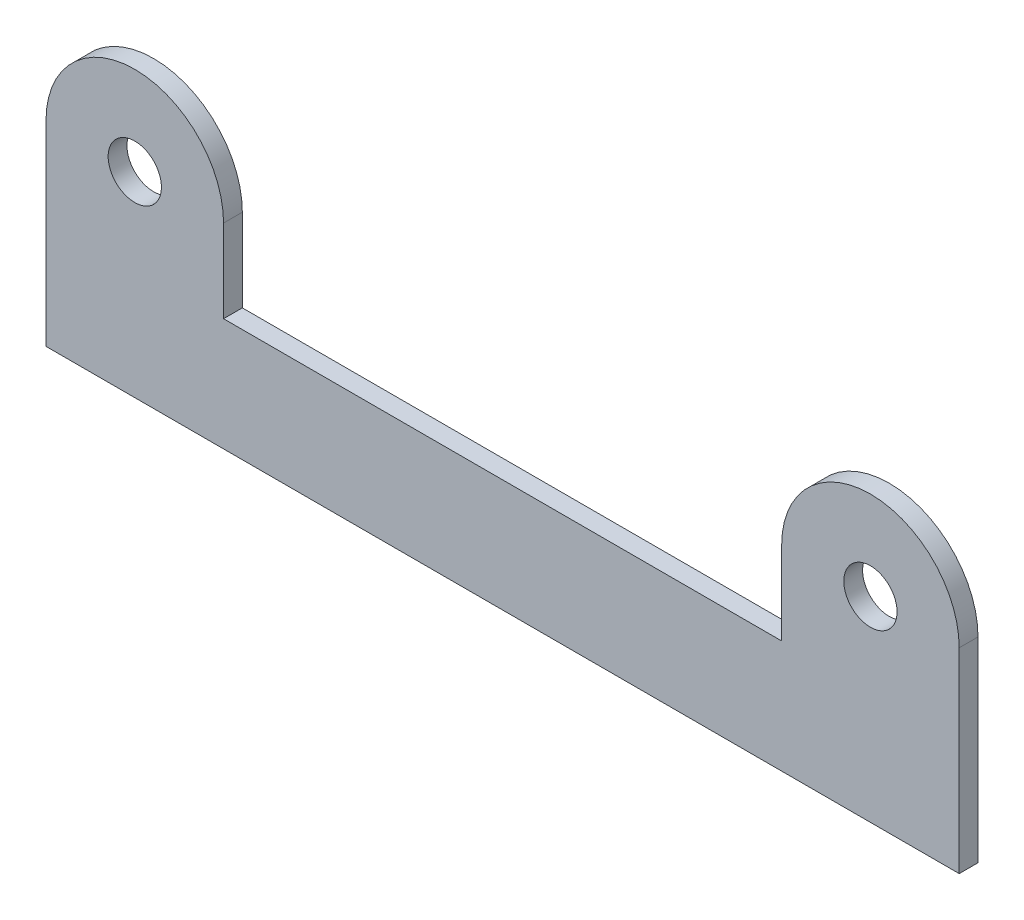
ISO-10303-21;
HEADER;
FILE_DESCRIPTION(('STEP AP214'),'2;1');
FILE_NAME('part.step','',(''),(''),'','','');
FILE_SCHEMA(('AUTOMOTIVE_DESIGN { 1 0 10303 214 1 1 1 1 }'));
ENDSEC;
DATA;
#1=APPLICATION_CONTEXT('core data for automotive mechanical design processes');
#2=APPLICATION_PROTOCOL_DEFINITION('international standard','automotive_design',2000,#1);
#3=PRODUCT_CONTEXT('',#1,'mechanical');
#4=PRODUCT('Part','Part','',(#3));
#5=PRODUCT_RELATED_PRODUCT_CATEGORY('part','',(#4));
#6=PRODUCT_DEFINITION_FORMATION('','',#4);
#7=PRODUCT_DEFINITION_CONTEXT('part definition',#1,'design');
#8=PRODUCT_DEFINITION('design','',#6,#7);
#9=PRODUCT_DEFINITION_SHAPE('','',#8);
#10=(LENGTH_UNIT() NAMED_UNIT(*) SI_UNIT(.MILLI.,.METRE.));
#11=(NAMED_UNIT(*) PLANE_ANGLE_UNIT() SI_UNIT($,.RADIAN.));
#12=(NAMED_UNIT(*) SI_UNIT($,.STERADIAN.) SOLID_ANGLE_UNIT());
#13=UNCERTAINTY_MEASURE_WITH_UNIT(LENGTH_MEASURE(1.E-05),#10,'distance_accuracy_value','');
#14=(GEOMETRIC_REPRESENTATION_CONTEXT(3) GLOBAL_UNCERTAINTY_ASSIGNED_CONTEXT((#13)) GLOBAL_UNIT_ASSIGNED_CONTEXT((#10,
#11,#12)) REPRESENTATION_CONTEXT('',''));
#15=CARTESIAN_POINT('',(0.,0.,0.));
#16=DIRECTION('',(0.,0.,1.));
#17=DIRECTION('',(1.,0.,0.));
#18=AXIS2_PLACEMENT_3D('',#15,#16,#17);
#19=CARTESIAN_POINT('',(-62.15,7.00000000000001,0.));
#20=DIRECTION('',(0.,0.,-1.));
#21=DIRECTION('',(-1.,0.,0.));
#22=AXIS2_PLACEMENT_3D('',#19,#20,#21);
#23=PLANE('',#22);
#24=CARTESIAN_POINT('',(0.,7.,0.));
#25=DIRECTION('',(0.,0.,1.));
#26=DIRECTION('',(1.,0.,0.));
#27=AXIS2_PLACEMENT_3D('',#24,#25,#26);
#28=CIRCLE('',#27,2.24999999999999);
#29=CARTESIAN_POINT('',(2.24999999999999,7.,0.));
#30=VERTEX_POINT('',#29);
#31=EDGE_CURVE('E219',#30,#30,#28,.T.);
#32=ORIENTED_EDGE('',*,*,#31,.F.);
#33=EDGE_LOOP('',(#32));
#34=FACE_BOUND('',#33,.T.);
#35=DIRECTION('',(0.,1.,0.));
#36=VECTOR('',#35,1.);
#37=CARTESIAN_POINT('',(-69.65,-9.525,0.));
#38=LINE('',#37,#36);
#39=CARTESIAN_POINT('',(-69.65,-9.525,0.));
#40=VERTEX_POINT('',#39);
#41=CARTESIAN_POINT('',(-69.65,7.00000000000001,0.));
#42=VERTEX_POINT('',#41);
#43=EDGE_CURVE('E137',#40,#42,#38,.T.);
#44=ORIENTED_EDGE('',*,*,#43,.F.);
#45=DIRECTION('',(-1.,0.,0.));
#46=VECTOR('',#45,1.);
#47=CARTESIAN_POINT('',(7.5,-9.525,0.));
#48=LINE('',#47,#46);
#49=CARTESIAN_POINT('',(7.5,-9.525,0.));
#50=VERTEX_POINT('',#49);
#51=EDGE_CURVE('E91',#50,#40,#48,.T.);
#52=ORIENTED_EDGE('',*,*,#51,.F.);
#53=DIRECTION('',(0.,-1.,0.));
#54=VECTOR('',#53,1.);
#55=CARTESIAN_POINT('',(7.5,7.,0.));
#56=LINE('',#55,#54);
#57=CARTESIAN_POINT('',(7.5,7.,0.));
#58=VERTEX_POINT('',#57);
#59=EDGE_CURVE('E85',#58,#50,#56,.T.);
#60=ORIENTED_EDGE('',*,*,#59,.F.);
#61=CARTESIAN_POINT('',(0.,7.,0.));
#62=DIRECTION('',(0.,0.,-1.));
#63=DIRECTION('',(-1.,0.,0.));
#64=AXIS2_PLACEMENT_3D('',#61,#62,#63);
#65=CIRCLE('',#64,7.5);
#66=CARTESIAN_POINT('',(-7.5,7.,0.));
#67=VERTEX_POINT('',#66);
#68=EDGE_CURVE('E127',#67,#58,#65,.T.);
#69=ORIENTED_EDGE('',*,*,#68,.F.);
#70=DIRECTION('',(0.,-1.,0.));
#71=VECTOR('',#70,1.);
#72=CARTESIAN_POINT('',(-7.5,7.,0.));
#73=LINE('',#72,#71);
#74=CARTESIAN_POINT('',(-7.5,0.,0.));
#75=VERTEX_POINT('',#74);
#76=EDGE_CURVE('E150',#67,#75,#73,.T.);
#77=ORIENTED_EDGE('',*,*,#76,.T.);
#78=DIRECTION('',(-1.,0.,0.));
#79=VECTOR('',#78,1.);
#80=CARTESIAN_POINT('',(-7.5,0.,0.));
#81=LINE('',#80,#79);
#82=CARTESIAN_POINT('',(-54.65,0.,0.));
#83=VERTEX_POINT('',#82);
#84=EDGE_CURVE('E147',#75,#83,#81,.T.);
#85=ORIENTED_EDGE('',*,*,#84,.T.);
#86=DIRECTION('',(0.,1.,0.));
#87=VECTOR('',#86,1.);
#88=CARTESIAN_POINT('',(-54.65,0.,0.));
#89=LINE('',#88,#87);
#90=CARTESIAN_POINT('',(-54.65,7.00000000000001,0.));
#91=VERTEX_POINT('',#90);
#92=EDGE_CURVE('E144',#83,#91,#89,.T.);
#93=ORIENTED_EDGE('',*,*,#92,.T.);
#94=CARTESIAN_POINT('',(-62.15,7.00000000000001,0.));
#95=DIRECTION('',(0.,0.,-1.));
#96=DIRECTION('',(-1.,0.,0.));
#97=AXIS2_PLACEMENT_3D('',#94,#95,#96);
#98=CIRCLE('',#97,7.5);
#99=EDGE_CURVE('E140',#42,#91,#98,.T.);
#100=ORIENTED_EDGE('',*,*,#99,.F.);
#101=EDGE_LOOP('',(#44,#52,#60,#69,#77,#85,#93,#100));
#102=FACE_BOUND('',#101,.T.);
#103=CARTESIAN_POINT('',(-62.15,7.00000000000001,0.));
#104=DIRECTION('',(0.,0.,1.));
#105=DIRECTION('',(1.,0.,0.));
#106=AXIS2_PLACEMENT_3D('',#103,#104,#105);
#107=CIRCLE('',#106,2.24999999999999);
#108=CARTESIAN_POINT('',(-59.9,7.00000000000001,0.));
#109=VERTEX_POINT('',#108);
#110=EDGE_CURVE('E221',#109,#109,#107,.T.);
#111=ORIENTED_EDGE('',*,*,#110,.F.);
#112=EDGE_LOOP('',(#111));
#113=FACE_BOUND('',#112,.T.);
#114=ADVANCED_FACE('F39',(#34,#102,#113),#23,.F.);
#115=CARTESIAN_POINT('',(-62.15,7.00000000000001,-1.5875));
#116=DIRECTION('',(0.,0.,-1.));
#117=DIRECTION('',(-1.,0.,0.));
#118=AXIS2_PLACEMENT_3D('',#115,#116,#117);
#119=PLANE('',#118);
#120=CARTESIAN_POINT('',(0.,7.,-1.5875));
#121=DIRECTION('',(0.,0.,1.));
#122=DIRECTION('',(1.,0.,0.));
#123=AXIS2_PLACEMENT_3D('',#120,#121,#122);
#124=CIRCLE('',#123,2.25);
#125=CARTESIAN_POINT('',(2.25,7.,-1.5875));
#126=VERTEX_POINT('',#125);
#127=EDGE_CURVE('E217',#126,#126,#124,.T.);
#128=ORIENTED_EDGE('',*,*,#127,.T.);
#129=EDGE_LOOP('',(#128));
#130=FACE_BOUND('',#129,.T.);
#131=DIRECTION('',(0.,1.,0.));
#132=VECTOR('',#131,1.);
#133=CARTESIAN_POINT('',(-69.65,-9.525,-1.5875));
#134=LINE('',#133,#132);
#135=CARTESIAN_POINT('',(-69.65,-9.525,-1.5875));
#136=VERTEX_POINT('',#135);
#137=CARTESIAN_POINT('',(-69.65,7.00000000000001,-1.5875));
#138=VERTEX_POINT('',#137);
#139=EDGE_CURVE('E156',#136,#138,#134,.T.);
#140=ORIENTED_EDGE('',*,*,#139,.T.);
#141=CARTESIAN_POINT('',(-62.15,7.00000000000001,-1.5875));
#142=DIRECTION('',(0.,0.,-1.));
#143=DIRECTION('',(-1.,0.,0.));
#144=AXIS2_PLACEMENT_3D('',#141,#142,#143);
#145=CIRCLE('',#144,7.5);
#146=CARTESIAN_POINT('',(-54.65,7.00000000000001,-1.5875));
#147=VERTEX_POINT('',#146);
#148=EDGE_CURVE('E99',#138,#147,#145,.T.);
#149=ORIENTED_EDGE('',*,*,#148,.T.);
#150=DIRECTION('',(0.,1.,0.));
#151=VECTOR('',#150,1.);
#152=CARTESIAN_POINT('',(-54.65,0.,-1.5875));
#153=LINE('',#152,#151);
#154=CARTESIAN_POINT('',(-54.65,0.,-1.5875));
#155=VERTEX_POINT('',#154);
#156=EDGE_CURVE('E168',#155,#147,#153,.T.);
#157=ORIENTED_EDGE('',*,*,#156,.F.);
#158=DIRECTION('',(-1.,0.,0.));
#159=VECTOR('',#158,1.);
#160=CARTESIAN_POINT('',(-7.5,0.,-1.5875));
#161=LINE('',#160,#159);
#162=CARTESIAN_POINT('',(-7.5,0.,-1.5875));
#163=VERTEX_POINT('',#162);
#164=EDGE_CURVE('E179',#163,#155,#161,.T.);
#165=ORIENTED_EDGE('',*,*,#164,.F.);
#166=DIRECTION('',(0.,-1.,0.));
#167=VECTOR('',#166,1.);
#168=CARTESIAN_POINT('',(-7.5,7.,-1.5875));
#169=LINE('',#168,#167);
#170=CARTESIAN_POINT('',(-7.5,7.,-1.5875));
#171=VERTEX_POINT('',#170);
#172=EDGE_CURVE('E121',#171,#163,#169,.T.);
#173=ORIENTED_EDGE('',*,*,#172,.F.);
#174=CARTESIAN_POINT('',(0.,7.,-1.5875));
#175=DIRECTION('',(0.,0.,-1.));
#176=DIRECTION('',(-1.,0.,0.));
#177=AXIS2_PLACEMENT_3D('',#174,#175,#176);
#178=CIRCLE('',#177,7.5);
#179=CARTESIAN_POINT('',(7.5,7.,-1.5875));
#180=VERTEX_POINT('',#179);
#181=EDGE_CURVE('E113',#171,#180,#178,.T.);
#182=ORIENTED_EDGE('',*,*,#181,.T.);
#183=DIRECTION('',(0.,-1.,0.));
#184=VECTOR('',#183,1.);
#185=CARTESIAN_POINT('',(7.5,7.,-1.5875));
#186=LINE('',#185,#184);
#187=CARTESIAN_POINT('',(7.5,-9.525,-1.5875));
#188=VERTEX_POINT('',#187);
#189=EDGE_CURVE('E118',#180,#188,#186,.T.);
#190=ORIENTED_EDGE('',*,*,#189,.T.);
#191=DIRECTION('',(-1.,0.,0.));
#192=VECTOR('',#191,1.);
#193=CARTESIAN_POINT('',(7.5,-9.525,-1.5875));
#194=LINE('',#193,#192);
#195=EDGE_CURVE('E56',#188,#136,#194,.T.);
#196=ORIENTED_EDGE('',*,*,#195,.T.);
#197=EDGE_LOOP('',(#140,#149,#157,#165,#173,#182,#190,#196));
#198=FACE_BOUND('',#197,.T.);
#199=CARTESIAN_POINT('',(-62.15,7.00000000000001,-1.5875));
#200=DIRECTION('',(0.,0.,1.));
#201=DIRECTION('',(1.,0.,0.));
#202=AXIS2_PLACEMENT_3D('',#199,#200,#201);
#203=CIRCLE('',#202,2.25);
#204=CARTESIAN_POINT('',(-59.9,7.00000000000001,-1.5875));
#205=VERTEX_POINT('',#204);
#206=EDGE_CURVE('E141',#205,#205,#203,.T.);
#207=ORIENTED_EDGE('',*,*,#206,.T.);
#208=EDGE_LOOP('',(#207));
#209=FACE_BOUND('',#208,.T.);
#210=ADVANCED_FACE('F115',(#130,#198,#209),#119,.T.);
#211=CARTESIAN_POINT('',(-69.65,-9.525,-1.5875));
#212=DIRECTION('',(1.,0.,0.));
#213=DIRECTION('',(0.,0.,-1.));
#214=AXIS2_PLACEMENT_3D('',#211,#212,#213);
#215=PLANE('',#214);
#216=ORIENTED_EDGE('',*,*,#43,.T.);
#217=DIRECTION('',(0.,0.,1.));
#218=VECTOR('',#217,1.);
#219=CARTESIAN_POINT('',(-69.65,7.00000000000001,-1.5875));
#220=LINE('',#219,#218);
#221=EDGE_CURVE('E11',#138,#42,#220,.T.);
#222=ORIENTED_EDGE('',*,*,#221,.F.);
#223=ORIENTED_EDGE('',*,*,#139,.F.);
#224=DIRECTION('',(0.,0.,1.));
#225=VECTOR('',#224,1.);
#226=CARTESIAN_POINT('',(-69.65,-9.525,-1.5875));
#227=LINE('',#226,#225);
#228=EDGE_CURVE('E133',#136,#40,#227,.T.);
#229=ORIENTED_EDGE('',*,*,#228,.T.);
#230=EDGE_LOOP('',(#216,#222,#223,#229));
#231=FACE_BOUND('',#230,.T.);
#232=ADVANCED_FACE('F41',(#231),#215,.F.);
#233=CARTESIAN_POINT('',(-62.15,7.00000000000001,-1.5875));
#234=DIRECTION('',(0.,0.,1.));
#235=DIRECTION('',(1.,0.,0.));
#236=AXIS2_PLACEMENT_3D('',#233,#234,#235);
#237=CYLINDRICAL_SURFACE('',#236,7.5);
#238=ORIENTED_EDGE('',*,*,#99,.T.);
#239=DIRECTION('',(0.,0.,1.));
#240=VECTOR('',#239,1.);
#241=CARTESIAN_POINT('',(-54.65,7.00000000000001,-1.5875));
#242=LINE('',#241,#240);
#243=EDGE_CURVE('E48',#147,#91,#242,.T.);
#244=ORIENTED_EDGE('',*,*,#243,.F.);
#245=ORIENTED_EDGE('',*,*,#148,.F.);
#246=ORIENTED_EDGE('',*,*,#221,.T.);
#247=EDGE_LOOP('',(#238,#244,#245,#246));
#248=FACE_BOUND('',#247,.T.);
#249=ADVANCED_FACE('F169',(#248),#237,.T.);
#250=CARTESIAN_POINT('',(-54.65,0.,-1.5875));
#251=DIRECTION('',(1.,0.,0.));
#252=DIRECTION('',(0.,0.,-1.));
#253=AXIS2_PLACEMENT_3D('',#250,#251,#252);
#254=PLANE('',#253);
#255=ORIENTED_EDGE('',*,*,#92,.F.);
#256=DIRECTION('',(0.,0.,1.));
#257=VECTOR('',#256,1.);
#258=CARTESIAN_POINT('',(-54.65,0.,-1.5875));
#259=LINE('',#258,#257);
#260=EDGE_CURVE('E162',#155,#83,#259,.T.);
#261=ORIENTED_EDGE('',*,*,#260,.F.);
#262=ORIENTED_EDGE('',*,*,#156,.T.);
#263=ORIENTED_EDGE('',*,*,#243,.T.);
#264=EDGE_LOOP('',(#255,#261,#262,#263));
#265=FACE_BOUND('',#264,.T.);
#266=ADVANCED_FACE('F166',(#265),#254,.T.);
#267=CARTESIAN_POINT('',(-7.5,0.,-1.5875));
#268=DIRECTION('',(0.,1.,0.));
#269=DIRECTION('',(0.,0.,1.));
#270=AXIS2_PLACEMENT_3D('',#267,#268,#269);
#271=PLANE('',#270);
#272=ORIENTED_EDGE('',*,*,#84,.F.);
#273=DIRECTION('',(0.,0.,1.));
#274=VECTOR('',#273,1.);
#275=CARTESIAN_POINT('',(-7.5,0.,-1.5875));
#276=LINE('',#275,#274);
#277=EDGE_CURVE('E160',#163,#75,#276,.T.);
#278=ORIENTED_EDGE('',*,*,#277,.F.);
#279=ORIENTED_EDGE('',*,*,#164,.T.);
#280=ORIENTED_EDGE('',*,*,#260,.T.);
#281=EDGE_LOOP('',(#272,#278,#279,#280));
#282=FACE_BOUND('',#281,.T.);
#283=ADVANCED_FACE('F177',(#282),#271,.T.);
#284=CARTESIAN_POINT('',(-7.5,7.,-1.5875));
#285=DIRECTION('',(-1.,0.,0.));
#286=DIRECTION('',(0.,-1.,0.));
#287=AXIS2_PLACEMENT_3D('',#284,#285,#286);
#288=PLANE('',#287);
#289=ORIENTED_EDGE('',*,*,#76,.F.);
#290=DIRECTION('',(0.,0.,1.));
#291=VECTOR('',#290,1.);
#292=CARTESIAN_POINT('',(-7.5,7.,-1.5875));
#293=LINE('',#292,#291);
#294=EDGE_CURVE('E128',#171,#67,#293,.T.);
#295=ORIENTED_EDGE('',*,*,#294,.F.);
#296=ORIENTED_EDGE('',*,*,#172,.T.);
#297=ORIENTED_EDGE('',*,*,#277,.T.);
#298=EDGE_LOOP('',(#289,#295,#296,#297));
#299=FACE_BOUND('',#298,.T.);
#300=ADVANCED_FACE('F185',(#299),#288,.T.);
#301=CARTESIAN_POINT('',(0.,7.,-1.5875));
#302=DIRECTION('',(0.,0.,1.));
#303=DIRECTION('',(1.,0.,0.));
#304=AXIS2_PLACEMENT_3D('',#301,#302,#303);
#305=CYLINDRICAL_SURFACE('',#304,7.5);
#306=ORIENTED_EDGE('',*,*,#68,.T.);
#307=DIRECTION('',(0.,0.,1.));
#308=VECTOR('',#307,1.);
#309=CARTESIAN_POINT('',(7.5,7.,-1.5875));
#310=LINE('',#309,#308);
#311=EDGE_CURVE('E124',#180,#58,#310,.T.);
#312=ORIENTED_EDGE('',*,*,#311,.F.);
#313=ORIENTED_EDGE('',*,*,#181,.F.);
#314=ORIENTED_EDGE('',*,*,#294,.T.);
#315=EDGE_LOOP('',(#306,#312,#313,#314));
#316=FACE_BOUND('',#315,.T.);
#317=ADVANCED_FACE('F125',(#316),#305,.T.);
#318=CARTESIAN_POINT('',(7.5,7.,-1.5875));
#319=DIRECTION('',(-1.,0.,0.));
#320=DIRECTION('',(0.,-1.,0.));
#321=AXIS2_PLACEMENT_3D('',#318,#319,#320);
#322=PLANE('',#321);
#323=ORIENTED_EDGE('',*,*,#59,.T.);
#324=DIRECTION('',(0.,0.,1.));
#325=VECTOR('',#324,1.);
#326=CARTESIAN_POINT('',(7.5,-9.525,-1.5875));
#327=LINE('',#326,#325);
#328=EDGE_CURVE('E129',#188,#50,#327,.T.);
#329=ORIENTED_EDGE('',*,*,#328,.F.);
#330=ORIENTED_EDGE('',*,*,#189,.F.);
#331=ORIENTED_EDGE('',*,*,#311,.T.);
#332=EDGE_LOOP('',(#323,#329,#330,#331));
#333=FACE_BOUND('',#332,.T.);
#334=ADVANCED_FACE('F131',(#333),#322,.F.);
#335=CARTESIAN_POINT('',(7.5,-9.525,-1.5875));
#336=DIRECTION('',(0.,1.,0.));
#337=DIRECTION('',(0.,0.,1.));
#338=AXIS2_PLACEMENT_3D('',#335,#336,#337);
#339=PLANE('',#338);
#340=ORIENTED_EDGE('',*,*,#51,.T.);
#341=ORIENTED_EDGE('',*,*,#228,.F.);
#342=ORIENTED_EDGE('',*,*,#195,.F.);
#343=ORIENTED_EDGE('',*,*,#328,.T.);
#344=EDGE_LOOP('',(#340,#341,#342,#343));
#345=FACE_BOUND('',#344,.T.);
#346=ADVANCED_FACE('F188',(#345),#339,.F.);
#347=CARTESIAN_POINT('',(-62.15,7.00000000000001,0.));
#348=DIRECTION('',(0.,0.,1.));
#349=DIRECTION('',(1.,0.,0.));
#350=AXIS2_PLACEMENT_3D('',#347,#348,#349);
#351=CYLINDRICAL_SURFACE('',#350,2.25);
#352=ORIENTED_EDGE('',*,*,#206,.F.);
#353=EDGE_LOOP('',(#352));
#354=FACE_BOUND('',#353,.T.);
#355=ORIENTED_EDGE('',*,*,#110,.T.);
#356=EDGE_LOOP('',(#355));
#357=FACE_BOUND('',#356,.T.);
#358=ADVANCED_FACE('F190',(#354,#357),#351,.F.);
#359=CARTESIAN_POINT('',(0.,7.,0.));
#360=DIRECTION('',(0.,0.,1.));
#361=DIRECTION('',(1.,0.,0.));
#362=AXIS2_PLACEMENT_3D('',#359,#360,#361);
#363=CYLINDRICAL_SURFACE('',#362,2.24999999999999);
#364=ORIENTED_EDGE('',*,*,#127,.F.);
#365=EDGE_LOOP('',(#364));
#366=FACE_BOUND('',#365,.T.);
#367=ORIENTED_EDGE('',*,*,#31,.T.);
#368=EDGE_LOOP('',(#367));
#369=FACE_BOUND('',#368,.T.);
#370=ADVANCED_FACE('F196',(#366,#369),#363,.F.);
#371=CLOSED_SHELL('',(#114,#210,#232,#249,#266,#283,#300,#317,#334,#346,#358,#370));
#372=MANIFOLD_SOLID_BREP('B2',#371);
#373=ADVANCED_BREP_SHAPE_REPRESENTATION('',(#18,#372),#14);
#374=SHAPE_DEFINITION_REPRESENTATION(#9,#373);
ENDSEC;
END-ISO-10303-21;
